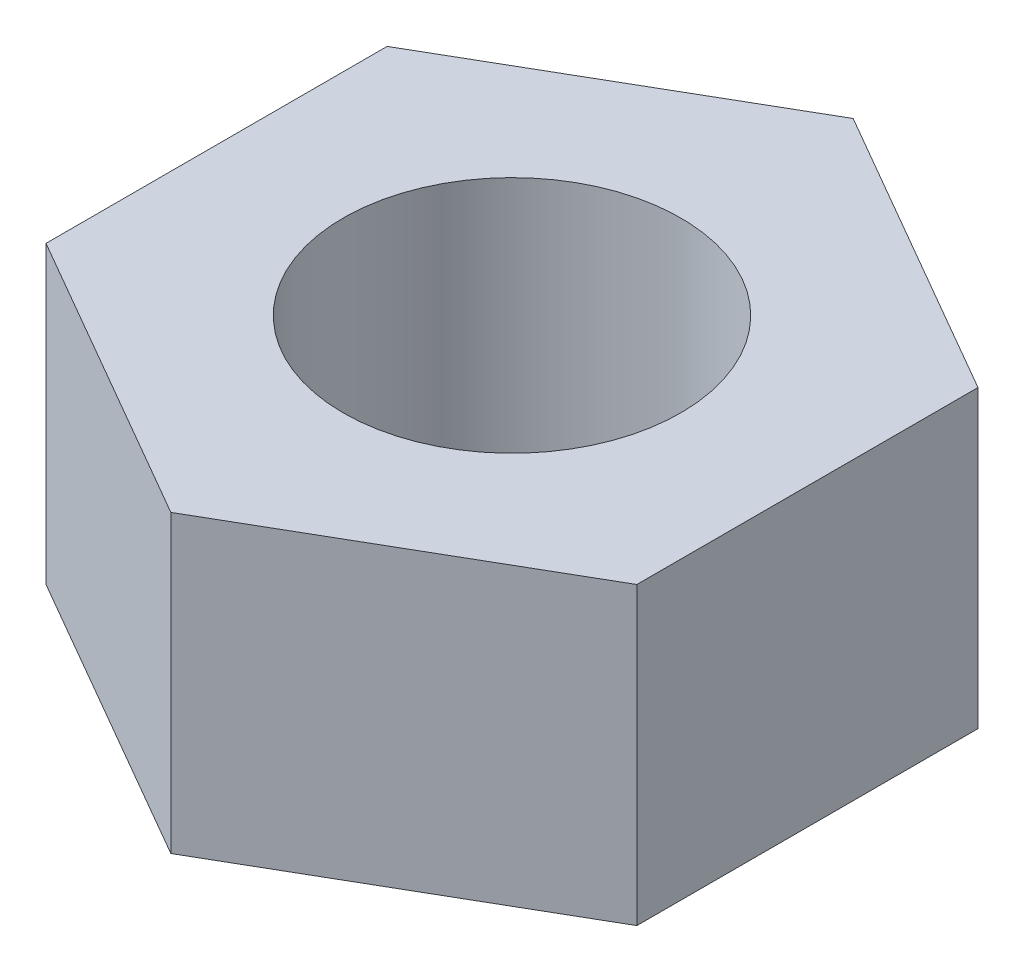
ISO-10303-21;
HEADER;
FILE_DESCRIPTION(('STEP AP214'),'2;1');
FILE_NAME('part.step','',(''),(''),'','','');
FILE_SCHEMA(('AUTOMOTIVE_DESIGN { 1 0 10303 214 1 1 1 1 }'));
ENDSEC;
DATA;
#1=APPLICATION_CONTEXT('core data for automotive mechanical design processes');
#2=APPLICATION_PROTOCOL_DEFINITION('international standard','automotive_design',2000,#1);
#3=PRODUCT_CONTEXT('',#1,'mechanical');
#4=PRODUCT('Part','Part','',(#3));
#5=PRODUCT_RELATED_PRODUCT_CATEGORY('part','',(#4));
#6=PRODUCT_DEFINITION_FORMATION('','',#4);
#7=PRODUCT_DEFINITION_CONTEXT('part definition',#1,'design');
#8=PRODUCT_DEFINITION('design','',#6,#7);
#9=PRODUCT_DEFINITION_SHAPE('','',#8);
#10=(LENGTH_UNIT() NAMED_UNIT(*) SI_UNIT(.MILLI.,.METRE.));
#11=(NAMED_UNIT(*) PLANE_ANGLE_UNIT() SI_UNIT($,.RADIAN.));
#12=(NAMED_UNIT(*) SI_UNIT($,.STERADIAN.) SOLID_ANGLE_UNIT());
#13=UNCERTAINTY_MEASURE_WITH_UNIT(LENGTH_MEASURE(1.E-05),#10,'distance_accuracy_value','');
#14=(GEOMETRIC_REPRESENTATION_CONTEXT(3) GLOBAL_UNCERTAINTY_ASSIGNED_CONTEXT((#13)) GLOBAL_UNIT_ASSIGNED_CONTEXT((#10,
#11,#12)) REPRESENTATION_CONTEXT('',''));
#15=CARTESIAN_POINT('',(0.,0.,0.));
#16=DIRECTION('',(0.,0.,1.));
#17=DIRECTION('',(1.,0.,0.));
#18=AXIS2_PLACEMENT_3D('',#15,#16,#17);
#19=CARTESIAN_POINT('',(0.,2.778125,0.));
#20=DIRECTION('',(0.,1.,0.));
#21=DIRECTION('',(0.,0.,-1.));
#22=AXIS2_PLACEMENT_3D('',#19,#20,#21);
#23=PLANE('',#22);
#24=DIRECTION('',(-0.866025403784439,0.,0.5));
#25=VECTOR('',#24,1.);
#26=CARTESIAN_POINT('',(5.55625,2.778125,3.20790243318486));
#27=LINE('',#26,#25);
#28=CARTESIAN_POINT('',(5.55625,2.778125,3.20790243318486));
#29=VERTEX_POINT('',#28);
#30=CARTESIAN_POINT('',(0.,2.778125,6.41580486636971));
#31=VERTEX_POINT('',#30);
#32=EDGE_CURVE('E114',#29,#31,#27,.T.);
#33=ORIENTED_EDGE('',*,*,#32,.F.);
#34=DIRECTION('',(0.,0.,1.));
#35=VECTOR('',#34,1.);
#36=CARTESIAN_POINT('',(5.55625,2.778125,-3.20790243318486));
#37=LINE('',#36,#35);
#38=CARTESIAN_POINT('',(5.55625,2.778125,-3.20790243318486));
#39=VERTEX_POINT('',#38);
#40=EDGE_CURVE('E133',#39,#29,#37,.T.);
#41=ORIENTED_EDGE('',*,*,#40,.F.);
#42=DIRECTION('',(0.866025403784439,0.,0.5));
#43=VECTOR('',#42,1.);
#44=CARTESIAN_POINT('',(0.,2.778125,-6.41580486636971));
#45=LINE('',#44,#43);
#46=CARTESIAN_POINT('',(0.,2.778125,-6.41580486636971));
#47=VERTEX_POINT('',#46);
#48=EDGE_CURVE('E131',#47,#39,#45,.T.);
#49=ORIENTED_EDGE('',*,*,#48,.F.);
#50=DIRECTION('',(0.866025403784439,0.,-0.5));
#51=VECTOR('',#50,1.);
#52=CARTESIAN_POINT('',(-5.55625,2.778125,-3.20790243318486));
#53=LINE('',#52,#51);
#54=CARTESIAN_POINT('',(-5.55625,2.778125,-3.20790243318486));
#55=VERTEX_POINT('',#54);
#56=EDGE_CURVE('E128',#55,#47,#53,.T.);
#57=ORIENTED_EDGE('',*,*,#56,.F.);
#58=DIRECTION('',(0.,0.,-1.));
#59=VECTOR('',#58,1.);
#60=CARTESIAN_POINT('',(-5.55625,2.778125,3.20790243318486));
#61=LINE('',#60,#59);
#62=CARTESIAN_POINT('',(-5.55625,2.778125,3.20790243318486));
#63=VERTEX_POINT('',#62);
#64=EDGE_CURVE('E120',#63,#55,#61,.T.);
#65=ORIENTED_EDGE('',*,*,#64,.F.);
#66=DIRECTION('',(-0.866025403784439,0.,-0.5));
#67=VECTOR('',#66,1.);
#68=CARTESIAN_POINT('',(0.,2.778125,6.41580486636971));
#69=LINE('',#68,#67);
#70=EDGE_CURVE('E117',#31,#63,#69,.T.);
#71=ORIENTED_EDGE('',*,*,#70,.F.);
#72=EDGE_LOOP('',(#33,#41,#49,#57,#65,#71));
#73=FACE_BOUND('',#72,.T.);
#74=CARTESIAN_POINT('',(0.,2.778125,0.));
#75=DIRECTION('',(0.,-1.,0.));
#76=DIRECTION('',(0.,0.,-1.));
#77=AXIS2_PLACEMENT_3D('',#74,#75,#76);
#78=CIRCLE('',#77,3.175);
#79=CARTESIAN_POINT('',(0.,2.778125,3.175));
#80=VERTEX_POINT('',#79);
#81=EDGE_CURVE('E118',#80,#80,#78,.T.);
#82=ORIENTED_EDGE('',*,*,#81,.T.);
#83=EDGE_LOOP('',(#82));
#84=FACE_BOUND('',#83,.T.);
#85=ADVANCED_FACE('F43',(#73,#84),#23,.T.);
#86=CARTESIAN_POINT('',(5.55625,2.778125,3.20790243318486));
#87=DIRECTION('',(-0.5,0.,-0.866025403784439));
#88=DIRECTION('',(0.866025403784439,0.,-0.5));
#89=AXIS2_PLACEMENT_3D('',#86,#87,#88);
#90=PLANE('',#89);
#91=DIRECTION('',(0.,-1.,0.));
#92=VECTOR('',#91,1.);
#93=CARTESIAN_POINT('',(5.55625,2.778125,3.20790243318486));
#94=LINE('',#93,#92);
#95=CARTESIAN_POINT('',(5.55625,-2.778125,3.20790243318486));
#96=VERTEX_POINT('',#95);
#97=EDGE_CURVE('E58',#29,#96,#94,.T.);
#98=ORIENTED_EDGE('',*,*,#97,.F.);
#99=ORIENTED_EDGE('',*,*,#32,.T.);
#100=DIRECTION('',(0.,-1.,0.));
#101=VECTOR('',#100,1.);
#102=CARTESIAN_POINT('',(0.,2.778125,6.41580486636971));
#103=LINE('',#102,#101);
#104=CARTESIAN_POINT('',(0.,-2.778125,6.41580486636971));
#105=VERTEX_POINT('',#104);
#106=EDGE_CURVE('E11',#31,#105,#103,.T.);
#107=ORIENTED_EDGE('',*,*,#106,.T.);
#108=DIRECTION('',(-0.866025403784439,0.,0.5));
#109=VECTOR('',#108,1.);
#110=CARTESIAN_POINT('',(5.55625,-2.778125,3.20790243318486));
#111=LINE('',#110,#109);
#112=EDGE_CURVE('E106',#96,#105,#111,.T.);
#113=ORIENTED_EDGE('',*,*,#112,.F.);
#114=EDGE_LOOP('',(#98,#99,#107,#113));
#115=FACE_BOUND('',#114,.T.);
#116=ADVANCED_FACE('F45',(#115),#90,.F.);
#117=CARTESIAN_POINT('',(0.,2.778125,6.41580486636971));
#118=DIRECTION('',(0.499999999999999,0.,-0.866025403784439));
#119=DIRECTION('',(0.866025403784439,0.,0.5));
#120=AXIS2_PLACEMENT_3D('',#117,#118,#119);
#121=PLANE('',#120);
#122=ORIENTED_EDGE('',*,*,#106,.F.);
#123=ORIENTED_EDGE('',*,*,#70,.T.);
#124=DIRECTION('',(0.,-1.,0.));
#125=VECTOR('',#124,1.);
#126=CARTESIAN_POINT('',(-5.55625,2.778125,3.20790243318486));
#127=LINE('',#126,#125);
#128=CARTESIAN_POINT('',(-5.55625,-2.778125,3.20790243318486));
#129=VERTEX_POINT('',#128);
#130=EDGE_CURVE('E51',#63,#129,#127,.T.);
#131=ORIENTED_EDGE('',*,*,#130,.T.);
#132=DIRECTION('',(-0.866025403784439,0.,-0.5));
#133=VECTOR('',#132,1.);
#134=CARTESIAN_POINT('',(0.,-2.778125,6.41580486636971));
#135=LINE('',#134,#133);
#136=EDGE_CURVE('E98',#105,#129,#135,.T.);
#137=ORIENTED_EDGE('',*,*,#136,.F.);
#138=EDGE_LOOP('',(#122,#123,#131,#137));
#139=FACE_BOUND('',#138,.T.);
#140=ADVANCED_FACE('F100',(#139),#121,.F.);
#141=CARTESIAN_POINT('',(-5.55625,2.778125,3.20790243318486));
#142=DIRECTION('',(1.,0.,0.));
#143=DIRECTION('',(0.,0.,1.));
#144=AXIS2_PLACEMENT_3D('',#141,#142,#143);
#145=PLANE('',#144);
#146=ORIENTED_EDGE('',*,*,#130,.F.);
#147=ORIENTED_EDGE('',*,*,#64,.T.);
#148=DIRECTION('',(0.,-1.,0.));
#149=VECTOR('',#148,1.);
#150=CARTESIAN_POINT('',(-5.55625,2.778125,-3.20790243318486));
#151=LINE('',#150,#149);
#152=CARTESIAN_POINT('',(-5.55625,-2.778125,-3.20790243318486));
#153=VERTEX_POINT('',#152);
#154=EDGE_CURVE('E140',#55,#153,#151,.T.);
#155=ORIENTED_EDGE('',*,*,#154,.T.);
#156=DIRECTION('',(0.,0.,-1.));
#157=VECTOR('',#156,1.);
#158=CARTESIAN_POINT('',(-5.55625,-2.778125,3.20790243318486));
#159=LINE('',#158,#157);
#160=EDGE_CURVE('E105',#129,#153,#159,.T.);
#161=ORIENTED_EDGE('',*,*,#160,.F.);
#162=EDGE_LOOP('',(#146,#147,#155,#161));
#163=FACE_BOUND('',#162,.T.);
#164=ADVANCED_FACE('F143',(#163),#145,.F.);
#165=CARTESIAN_POINT('',(-5.55625,2.778125,-3.20790243318486));
#166=DIRECTION('',(0.499999999999999,0.,0.866025403784439));
#167=DIRECTION('',(-0.866025403784439,0.,0.5));
#168=AXIS2_PLACEMENT_3D('',#165,#166,#167);
#169=PLANE('',#168);
#170=ORIENTED_EDGE('',*,*,#154,.F.);
#171=ORIENTED_EDGE('',*,*,#56,.T.);
#172=DIRECTION('',(0.,-1.,0.));
#173=VECTOR('',#172,1.);
#174=CARTESIAN_POINT('',(0.,2.778125,-6.41580486636971));
#175=LINE('',#174,#173);
#176=CARTESIAN_POINT('',(0.,-2.778125,-6.41580486636971));
#177=VERTEX_POINT('',#176);
#178=EDGE_CURVE('E137',#47,#177,#175,.T.);
#179=ORIENTED_EDGE('',*,*,#178,.T.);
#180=DIRECTION('',(0.866025403784439,0.,-0.5));
#181=VECTOR('',#180,1.);
#182=CARTESIAN_POINT('',(-5.55625,-2.778125,-3.20790243318486));
#183=LINE('',#182,#181);
#184=EDGE_CURVE('E150',#153,#177,#183,.T.);
#185=ORIENTED_EDGE('',*,*,#184,.F.);
#186=EDGE_LOOP('',(#170,#171,#179,#185));
#187=FACE_BOUND('',#186,.T.);
#188=ADVANCED_FACE('F147',(#187),#169,.F.);
#189=CARTESIAN_POINT('',(0.,2.778125,-6.41580486636971));
#190=DIRECTION('',(-0.5,0.,0.866025403784439));
#191=DIRECTION('',(-0.866025403784439,0.,-0.5));
#192=AXIS2_PLACEMENT_3D('',#189,#190,#191);
#193=PLANE('',#192);
#194=ORIENTED_EDGE('',*,*,#178,.F.);
#195=ORIENTED_EDGE('',*,*,#48,.T.);
#196=DIRECTION('',(0.,-1.,0.));
#197=VECTOR('',#196,1.);
#198=CARTESIAN_POINT('',(5.55625,2.778125,-3.20790243318486));
#199=LINE('',#198,#197);
#200=CARTESIAN_POINT('',(5.55625,-2.778125,-3.20790243318486));
#201=VERTEX_POINT('',#200);
#202=EDGE_CURVE('E65',#39,#201,#199,.T.);
#203=ORIENTED_EDGE('',*,*,#202,.T.);
#204=DIRECTION('',(0.866025403784439,0.,0.5));
#205=VECTOR('',#204,1.);
#206=CARTESIAN_POINT('',(0.,-2.778125,-6.41580486636971));
#207=LINE('',#206,#205);
#208=EDGE_CURVE('E151',#177,#201,#207,.T.);
#209=ORIENTED_EDGE('',*,*,#208,.F.);
#210=EDGE_LOOP('',(#194,#195,#203,#209));
#211=FACE_BOUND('',#210,.T.);
#212=ADVANCED_FACE('F156',(#211),#193,.F.);
#213=CARTESIAN_POINT('',(5.55625,2.778125,-3.20790243318486));
#214=DIRECTION('',(-1.,0.,0.));
#215=DIRECTION('',(0.,0.,-1.));
#216=AXIS2_PLACEMENT_3D('',#213,#214,#215);
#217=PLANE('',#216);
#218=ORIENTED_EDGE('',*,*,#202,.F.);
#219=ORIENTED_EDGE('',*,*,#40,.T.);
#220=ORIENTED_EDGE('',*,*,#97,.T.);
#221=DIRECTION('',(0.,0.,1.));
#222=VECTOR('',#221,1.);
#223=CARTESIAN_POINT('',(5.55625,-2.778125,-3.20790243318486));
#224=LINE('',#223,#222);
#225=EDGE_CURVE('E110',#201,#96,#224,.T.);
#226=ORIENTED_EDGE('',*,*,#225,.F.);
#227=EDGE_LOOP('',(#218,#219,#220,#226));
#228=FACE_BOUND('',#227,.T.);
#229=ADVANCED_FACE('F158',(#228),#217,.F.);
#230=CARTESIAN_POINT('',(0.,2.778125,0.));
#231=DIRECTION('',(0.,-1.,0.));
#232=DIRECTION('',(0.,0.,1.));
#233=AXIS2_PLACEMENT_3D('',#230,#231,#232);
#234=CYLINDRICAL_SURFACE('',#233,3.175);
#235=CARTESIAN_POINT('',(0.,-2.778125,0.));
#236=DIRECTION('',(0.,-1.,0.));
#237=DIRECTION('',(0.,0.,-1.));
#238=AXIS2_PLACEMENT_3D('',#235,#236,#237);
#239=CIRCLE('',#238,3.175);
#240=CARTESIAN_POINT('',(0.,-2.778125,3.175));
#241=VERTEX_POINT('',#240);
#242=EDGE_CURVE('E111',#241,#241,#239,.T.);
#243=CARTESIAN_POINT('',(0.,2.778125,3.175));
#244=CARTESIAN_POINT('',(0.,2.72024739583334,3.175));
#245=CARTESIAN_POINT('',(0.,2.66236979166667,3.175));
#246=CARTESIAN_POINT('',(0.,2.54661458333334,3.175));
#247=CARTESIAN_POINT('',(0.,2.48873697916667,3.175));
#248=CARTESIAN_POINT('',(0.,2.37298177083334,3.175));
#249=CARTESIAN_POINT('',(0.,2.31510416666667,3.175));
#250=CARTESIAN_POINT('',(0.,2.19934895833334,3.175));
#251=CARTESIAN_POINT('',(0.,2.14147135416667,3.175));
#252=CARTESIAN_POINT('',(0.,2.02571614583334,3.175));
#253=CARTESIAN_POINT('',(0.,1.96783854166667,3.175));
#254=CARTESIAN_POINT('',(0.,1.85208333333334,3.175));
#255=CARTESIAN_POINT('',(0.,1.79420572916667,3.175));
#256=CARTESIAN_POINT('',(0.,1.67845052083334,3.175));
#257=CARTESIAN_POINT('',(0.,1.62057291666667,3.175));
#258=CARTESIAN_POINT('',(0.,1.50481770833334,3.175));
#259=CARTESIAN_POINT('',(0.,1.44694010416667,3.175));
#260=CARTESIAN_POINT('',(0.,1.33118489583334,3.175));
#261=CARTESIAN_POINT('',(0.,1.27330729166667,3.175));
#262=CARTESIAN_POINT('',(0.,1.15755208333334,3.175));
#263=CARTESIAN_POINT('',(0.,1.09967447916667,3.175));
#264=CARTESIAN_POINT('',(0.,0.983919270833336,3.175));
#265=CARTESIAN_POINT('',(0.,0.926041666666669,3.175));
#266=CARTESIAN_POINT('',(0.,0.810286458333336,3.175));
#267=CARTESIAN_POINT('',(0.,0.752408854166669,3.175));
#268=CARTESIAN_POINT('',(0.,0.636653645833336,3.175));
#269=CARTESIAN_POINT('',(0.,0.57877604166667,3.175));
#270=CARTESIAN_POINT('',(0.,0.463020833333336,3.175));
#271=CARTESIAN_POINT('',(0.,0.405143229166669,3.175));
#272=CARTESIAN_POINT('',(0.,0.289388020833336,3.175));
#273=CARTESIAN_POINT('',(0.,0.231510416666669,3.175));
#274=CARTESIAN_POINT('',(0.,0.115755208333336,3.175));
#275=CARTESIAN_POINT('',(0.,0.0578776041666693,3.175));
#276=CARTESIAN_POINT('',(0.,-0.057877604166664,3.175));
#277=CARTESIAN_POINT('',(0.,-0.115755208333331,3.175));
#278=CARTESIAN_POINT('',(0.,-0.231510416666664,3.175));
#279=CARTESIAN_POINT('',(0.,-0.289388020833331,3.175));
#280=CARTESIAN_POINT('',(0.,-0.405143229166664,3.175));
#281=CARTESIAN_POINT('',(0.,-0.463020833333331,3.175));
#282=CARTESIAN_POINT('',(0.,-0.578776041666664,3.175));
#283=CARTESIAN_POINT('',(0.,-0.636653645833331,3.175));
#284=CARTESIAN_POINT('',(0.,-0.752408854166664,3.175));
#285=CARTESIAN_POINT('',(0.,-0.810286458333331,3.175));
#286=CARTESIAN_POINT('',(0.,-0.926041666666664,3.175));
#287=CARTESIAN_POINT('',(0.,-0.983919270833331,3.175));
#288=CARTESIAN_POINT('',(0.,-1.09967447916666,3.175));
#289=CARTESIAN_POINT('',(0.,-1.15755208333333,3.175));
#290=CARTESIAN_POINT('',(0.,-1.27330729166666,3.175));
#291=CARTESIAN_POINT('',(0.,-1.33118489583333,3.175));
#292=CARTESIAN_POINT('',(0.,-1.44694010416666,3.175));
#293=CARTESIAN_POINT('',(0.,-1.50481770833333,3.175));
#294=CARTESIAN_POINT('',(0.,-1.62057291666666,3.175));
#295=CARTESIAN_POINT('',(0.,-1.67845052083333,3.175));
#296=CARTESIAN_POINT('',(0.,-1.79420572916666,3.175));
#297=CARTESIAN_POINT('',(0.,-1.85208333333333,3.175));
#298=CARTESIAN_POINT('',(0.,-1.96783854166667,3.175));
#299=CARTESIAN_POINT('',(0.,-2.02571614583333,3.175));
#300=CARTESIAN_POINT('',(0.,-2.14147135416667,3.175));
#301=CARTESIAN_POINT('',(0.,-2.19934895833333,3.175));
#302=CARTESIAN_POINT('',(0.,-2.31510416666667,3.175));
#303=CARTESIAN_POINT('',(0.,-2.37298177083333,3.175));
#304=CARTESIAN_POINT('',(0.,-2.48873697916666,3.175));
#305=CARTESIAN_POINT('',(0.,-2.54661458333333,3.175));
#306=CARTESIAN_POINT('',(0.,-2.66236979166667,3.175));
#307=CARTESIAN_POINT('',(0.,-2.72024739583333,3.175));
#308=CARTESIAN_POINT('',(0.,-2.778125,3.175));
#309=B_SPLINE_CURVE_WITH_KNOTS('',3,(#243,#244,#245,#246,#247,#248,#249,#250,#251,#252,#253,
#254,#255,#256,#257,#258,#259,#260,#261,#262,#263,#264,#265,#266,#267,#268,#269,#270,#271,#272,
#273,#274,#275,#276,#277,#278,#279,#280,#281,#282,#283,#284,#285,#286,#287,#288,#289,#290,#291,
#292,#293,#294,#295,#296,#297,#298,#299,#300,#301,#302,#303,#304,#305,#306,#307,#308),
.UNSPECIFIED.,.F.,.F.,(4,2,2,2,2,2,2,2,2,2,2,2,2,2,2,2,2,2,2,2,2,2,2,2,2,2,2,2,2,2,2,2,4),(0.,
0.1736328125,0.347265625,0.5208984375,0.69453125,0.8681640625,1.041796875,1.2154296875,
1.3890625,1.5626953125,1.736328125,1.9099609375,2.08359375,2.2572265625,2.430859375,
2.6044921875,2.778125,2.9517578125,3.125390625,3.2990234375,3.47265625,3.6462890625,3.819921875,
3.9935546875,4.1671875,4.3408203125,4.514453125,4.6880859375,4.86171875,5.0353515625,
5.208984375,5.3826171875,5.55625),.UNSPECIFIED.);
#310=EDGE_CURVE('BSEAM160',#80,#241,#309,.T.);
#311=ORIENTED_EDGE('',*,*,#81,.F.);
#312=ORIENTED_EDGE('',*,*,#242,.T.);
#313=ORIENTED_EDGE('',*,*,#310,.T.);
#314=ORIENTED_EDGE('',*,*,#310,.F.);
#315=EDGE_LOOP('',(#311,#313,#312,#314));
#316=FACE_BOUND('',#315,.T.);
#317=ADVANCED_FACE('F160',(#316),#234,.F.);
#318=CARTESIAN_POINT('',(0.,-2.778125,0.));
#319=DIRECTION('',(0.,1.,0.));
#320=DIRECTION('',(0.,0.,-1.));
#321=AXIS2_PLACEMENT_3D('',#318,#319,#320);
#322=PLANE('',#321);
#323=ORIENTED_EDGE('',*,*,#242,.F.);
#324=EDGE_LOOP('',(#323));
#325=FACE_BOUND('',#324,.T.);
#326=ORIENTED_EDGE('',*,*,#112,.T.);
#327=ORIENTED_EDGE('',*,*,#136,.T.);
#328=ORIENTED_EDGE('',*,*,#160,.T.);
#329=ORIENTED_EDGE('',*,*,#184,.T.);
#330=ORIENTED_EDGE('',*,*,#208,.T.);
#331=ORIENTED_EDGE('',*,*,#225,.T.);
#332=EDGE_LOOP('',(#326,#327,#328,#329,#330,#331));
#333=FACE_BOUND('',#332,.T.);
#334=ADVANCED_FACE('F108',(#325,#333),#322,.F.);
#335=CLOSED_SHELL('',(#85,#116,#140,#164,#188,#212,#229,#317,#334));
#336=MANIFOLD_SOLID_BREP('B2',#335);
#337=ADVANCED_BREP_SHAPE_REPRESENTATION('',(#18,#336),#14);
#338=SHAPE_DEFINITION_REPRESENTATION(#9,#337);
ENDSEC;
END-ISO-10303-21;
